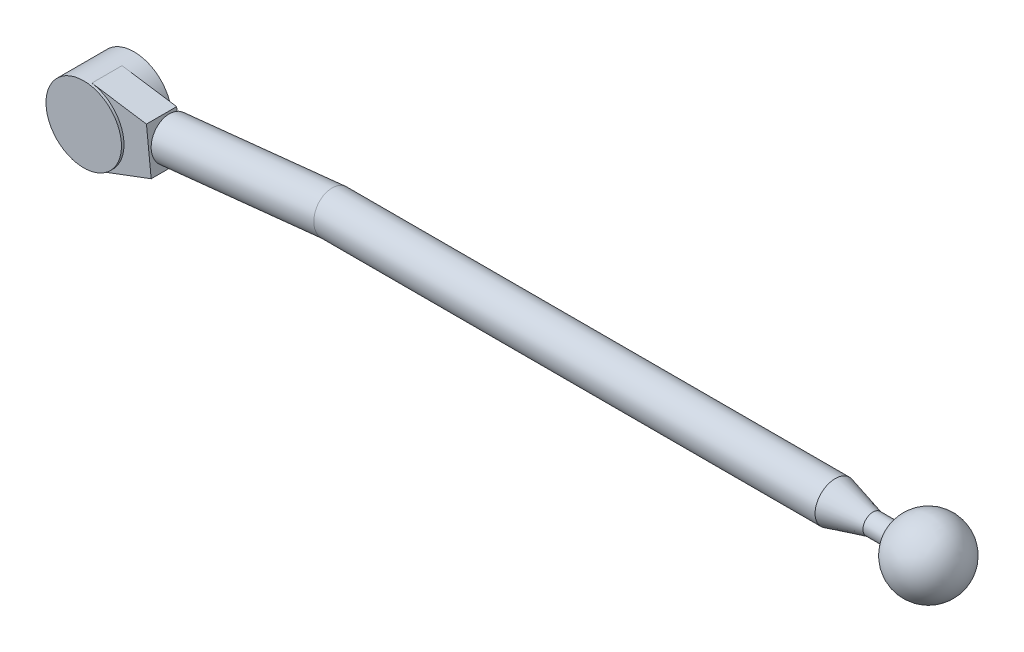
ISO-10303-21;
HEADER;
FILE_DESCRIPTION(('STEP AP214'),'2;1');
FILE_NAME('part.step','',(''),(''),'','','');
FILE_SCHEMA(('AUTOMOTIVE_DESIGN { 1 0 10303 214 1 1 1 1 }'));
ENDSEC;
DATA;
#1=APPLICATION_CONTEXT('core data for automotive mechanical design processes');
#2=APPLICATION_PROTOCOL_DEFINITION('international standard','automotive_design',2000,#1);
#3=PRODUCT_CONTEXT('',#1,'mechanical');
#4=PRODUCT('Part','Part','',(#3));
#5=PRODUCT_RELATED_PRODUCT_CATEGORY('part','',(#4));
#6=PRODUCT_DEFINITION_FORMATION('','',#4);
#7=PRODUCT_DEFINITION_CONTEXT('part definition',#1,'design');
#8=PRODUCT_DEFINITION('design','',#6,#7);
#9=PRODUCT_DEFINITION_SHAPE('','',#8);
#10=(LENGTH_UNIT() NAMED_UNIT(*) SI_UNIT(.MILLI.,.METRE.));
#11=(NAMED_UNIT(*) PLANE_ANGLE_UNIT() SI_UNIT($,.RADIAN.));
#12=(NAMED_UNIT(*) SI_UNIT($,.STERADIAN.) SOLID_ANGLE_UNIT());
#13=UNCERTAINTY_MEASURE_WITH_UNIT(LENGTH_MEASURE(1.E-05),#10,'distance_accuracy_value','');
#14=(GEOMETRIC_REPRESENTATION_CONTEXT(3) GLOBAL_UNCERTAINTY_ASSIGNED_CONTEXT((#13)) GLOBAL_UNIT_ASSIGNED_CONTEXT((#10,
#11,#12)) REPRESENTATION_CONTEXT('',''));
#15=CARTESIAN_POINT('',(0.,0.,0.));
#16=DIRECTION('',(0.,0.,1.));
#17=DIRECTION('',(1.,0.,0.));
#18=AXIS2_PLACEMENT_3D('',#15,#16,#17);
#19=CARTESIAN_POINT('',(-236.360559982317,88.4268991587526,1407.2355645497));
#20=DIRECTION('',(0.,1.,0.));
#21=DIRECTION('',(0.,0.,-1.));
#22=AXIS2_PLACEMENT_3D('',#19,#20,#21);
#23=SPHERICAL_SURFACE('',#22,14.);
#24=CARTESIAN_POINT('',(-236.360559982317,88.4268991587526,1407.2355645497));
#25=DIRECTION('',(-1.,0.,0.));
#26=DIRECTION('',(0.,1.,0.));
#27=AXIS2_PLACEMENT_3D('',#24,#25,#26);
#28=SPHERICAL_SURFACE('',#27,14.);
#29=CARTESIAN_POINT('',(-249.776967847315,88.4268991587526,1407.2355645497));
#30=DIRECTION('',(-0.999999999999999,0.,0.));
#31=DIRECTION('',(0.,1.,0.));
#32=AXIS2_PLACEMENT_3D('',#29,#30,#31);
#33=CIRCLE('',#32,4.);
#34=CARTESIAN_POINT('',(-249.776967847315,92.4268991587526,1407.2355645497));
#35=VERTEX_POINT('',#34);
#36=EDGE_CURVE('E182',#35,#35,#33,.F.);
#37=ORIENTED_EDGE('',*,*,#36,.T.);
#38=EDGE_LOOP('',(#37));
#39=FACE_BOUND('',#38,.T.);
#40=ADVANCED_FACE('F47',(#39),#28,.T.);
#41=CARTESIAN_POINT('',(-258.360559982317,88.4268991587526,1407.2355645497));
#42=DIRECTION('',(1.,0.,0.));
#43=DIRECTION('',(0.,1.,0.));
#44=AXIS2_PLACEMENT_3D('',#41,#42,#43);
#45=CYLINDRICAL_SURFACE('',#44,4.);
#46=CARTESIAN_POINT('',(-258.360559982317,88.4268991587526,1407.2355645497));
#47=DIRECTION('',(1.,0.,0.));
#48=DIRECTION('',(0.,-1.,0.));
#49=AXIS2_PLACEMENT_3D('',#46,#47,#48);
#50=CIRCLE('',#49,4.);
#51=CARTESIAN_POINT('',(-258.360559982317,84.4268991587526,1407.2355645497));
#52=VERTEX_POINT('',#51);
#53=EDGE_CURVE('E186',#52,#52,#50,.T.);
#54=ORIENTED_EDGE('',*,*,#53,.T.);
#55=EDGE_LOOP('',(#54));
#56=FACE_BOUND('',#55,.T.);
#57=ORIENTED_EDGE('',*,*,#36,.F.);
#58=EDGE_LOOP('',(#57));
#59=FACE_BOUND('',#58,.T.);
#60=ADVANCED_FACE('F171',(#56,#59),#45,.T.);
#61=CARTESIAN_POINT('',(-258.360559982317,88.4268991587526,1407.2355645497));
#62=DIRECTION('',(-1.,0.,0.));
#63=DIRECTION('',(0.,-1.,0.));
#64=AXIS2_PLACEMENT_3D('',#61,#62,#63);
#65=CONICAL_SURFACE('',#64,4.,0.261799387799149);
#66=CARTESIAN_POINT('',(-273.360559982317,88.4268991587526,1407.2355645497));
#67=DIRECTION('',(1.,0.,0.));
#68=DIRECTION('',(0.,-1.,0.));
#69=AXIS2_PLACEMENT_3D('',#66,#67,#68);
#70=CIRCLE('',#69,8.01923788646685);
#71=CARTESIAN_POINT('',(-273.360559982317,80.4076612722857,1407.2355645497));
#72=VERTEX_POINT('',#71);
#73=EDGE_CURVE('E153',#72,#72,#70,.T.);
#74=ORIENTED_EDGE('',*,*,#73,.T.);
#75=EDGE_LOOP('',(#74));
#76=FACE_BOUND('',#75,.T.);
#77=ORIENTED_EDGE('',*,*,#53,.F.);
#78=EDGE_LOOP('',(#77));
#79=FACE_BOUND('',#78,.T.);
#80=ADVANCED_FACE('F167',(#76,#79),#65,.T.);
#81=CARTESIAN_POINT('',(-473.360559982317,88.4268991587526,1407.2355645497));
#82=DIRECTION('',(1.,0.,0.));
#83=DIRECTION('',(0.,1.,0.));
#84=AXIS2_PLACEMENT_3D('',#81,#82,#83);
#85=CYLINDRICAL_SURFACE('',#84,8.01923788646685);
#86=CARTESIAN_POINT('',(-472.517704116846,88.4268991587526,1407.2355645497));
#87=DIRECTION('',(0.994521895368274,0.104528463267644,0.));
#88=DIRECTION('',(0.104528463267644,-0.994521895368274,0.));
#89=AXIS2_PLACEMENT_3D('',#86,#87,#88);
#90=ELLIPSE('',#89,8.06341009063184,8.01923788646685);
#91=CARTESIAN_POINT('',(-471.674848251376,80.4076612722857,1407.2355645497));
#92=VERTEX_POINT('',#91);
#93=EDGE_CURVE('E147',#92,#92,#90,.T.);
#94=ORIENTED_EDGE('',*,*,#93,.T.);
#95=EDGE_LOOP('',(#94));
#96=FACE_BOUND('',#95,.T.);
#97=ORIENTED_EDGE('',*,*,#73,.F.);
#98=EDGE_LOOP('',(#97));
#99=FACE_BOUND('',#98,.T.);
#100=ADVANCED_FACE('F162',(#96,#99),#85,.T.);
#101=CARTESIAN_POINT('',(-537.161627315784,81.6325490463557,1407.2355645497));
#102=DIRECTION('',(0.994521895368274,0.104528463267644,0.));
#103=DIRECTION('',(0.104528463267644,-0.994521895368274,0.));
#104=AXIS2_PLACEMENT_3D('',#101,#102,#103);
#105=ELLIPSE('',#104,8.06341009063184,8.01923788646685);
#106=DIRECTION('',(0.994521895368274,0.104528463267644,0.));
#107=VECTOR('',#106,1.);
#108=SURFACE_OF_LINEAR_EXTRUSION('',#105,#107);
#109=CARTESIAN_POINT('',(-536.379972719737,74.1956023422475,1404.2355645497));
#110=VERTEX_POINT('',#109);
#111=CARTESIAN_POINT('',(-537.943281911831,89.069495750464,1404.2355645497));
#112=VERTEX_POINT('',#111);
#113=EDGE_CURVE('E148',#110,#112,#105,.T.);
#114=ORIENTED_EDGE('',*,*,#113,.T.);
#115=EDGE_CURVE('E154',#112,#110,#105,.T.);
#116=ORIENTED_EDGE('',*,*,#115,.T.);
#117=EDGE_LOOP('',(#114,#116));
#118=FACE_BOUND('',#117,.T.);
#119=ORIENTED_EDGE('',*,*,#93,.F.);
#120=EDGE_LOOP('',(#119));
#121=FACE_BOUND('',#120,.T.);
#122=ADVANCED_FACE('F157',(#118,#121),#108,.T.);
#123=CARTESIAN_POINT('',(-537.161627315784,81.6325490463557,1407.2355645497));
#124=DIRECTION('',(-0.994521895368274,-0.104528463267644,0.));
#125=DIRECTION('',(0.104528463267644,-0.994521895368274,0.));
#126=AXIS2_PLACEMENT_3D('',#123,#124,#125);
#127=PLANE('',#126);
#128=DIRECTION('',(-0.104528463267639,0.994521895368275,0.));
#129=VECTOR('',#128,1.);
#130=CARTESIAN_POINT('',(-538.102383485193,90.5832461046702,1404.2355645497));
#131=LINE('',#130,#129);
#132=EDGE_CURVE('E185',#110,#112,#131,.T.);
#133=ORIENTED_EDGE('',*,*,#132,.T.);
#134=ORIENTED_EDGE('',*,*,#113,.F.);
#135=EDGE_LOOP('',(#133,#134));
#136=FACE_BOUND('',#135,.T.);
#137=ADVANCED_FACE('F161',(#136),#127,.T.);
#138=CARTESIAN_POINT('',(-538.102383485193,90.5832461046702,1404.2355645497));
#139=DIRECTION('',(-0.994521895368275,-0.104528463267639,0.));
#140=DIRECTION('',(0.104528463267639,-0.994521895368275,0.));
#141=AXIS2_PLACEMENT_3D('',#138,#139,#140);
#142=PLANE('',#141);
#143=CARTESIAN_POINT('',(-538.102383485193,90.5832461046702,1404.2355645497));
#144=VERTEX_POINT('',#143);
#145=EDGE_CURVE('E70',#112,#144,#131,.T.);
#146=ORIENTED_EDGE('',*,*,#145,.T.);
#147=DIRECTION('',(0.,0.,1.));
#148=VECTOR('',#147,1.);
#149=CARTESIAN_POINT('',(-538.102383485193,90.5832461046702,1404.2355645497));
#150=LINE('',#149,#148);
#151=CARTESIAN_POINT('',(-538.102383485193,90.5832461046702,1416.2355645497));
#152=VERTEX_POINT('',#151);
#153=EDGE_CURVE('E141',#144,#152,#150,.T.);
#154=ORIENTED_EDGE('',*,*,#153,.T.);
#155=DIRECTION('',(-0.104528463267639,0.994521895368275,0.));
#156=VECTOR('',#155,1.);
#157=CARTESIAN_POINT('',(-538.102383485193,90.5832461046702,1416.2355645497));
#158=LINE('',#157,#156);
#159=CARTESIAN_POINT('',(-536.220871146375,72.6818519880413,1416.2355645497));
#160=VERTEX_POINT('',#159);
#161=EDGE_CURVE('E124',#160,#152,#158,.T.);
#162=ORIENTED_EDGE('',*,*,#161,.F.);
#163=DIRECTION('',(0.,0.,1.));
#164=VECTOR('',#163,1.);
#165=CARTESIAN_POINT('',(-536.220871146375,72.6818519880413,1404.2355645497));
#166=LINE('',#165,#164);
#167=CARTESIAN_POINT('',(-536.220871146375,72.6818519880413,1404.2355645497));
#168=VERTEX_POINT('',#167);
#169=EDGE_CURVE('E121',#168,#160,#166,.T.);
#170=ORIENTED_EDGE('',*,*,#169,.F.);
#171=EDGE_CURVE('E63',#168,#110,#131,.T.);
#172=ORIENTED_EDGE('',*,*,#171,.T.);
#173=ORIENTED_EDGE('',*,*,#115,.F.);
#174=EDGE_LOOP('',(#146,#154,#162,#170,#172,#173));
#175=FACE_BOUND('',#174,.T.);
#176=ADVANCED_FACE('F227',(#175),#142,.F.);
#177=CARTESIAN_POINT('',(-536.220871146375,72.6818519880413,1404.2355645497));
#178=DIRECTION('',(-0.351367061986771,0.936237783765847,0.));
#179=DIRECTION('',(-0.936237783765847,-0.351367061986771,0.));
#180=AXIS2_PLACEMENT_3D('',#177,#178,#179);
#181=PLANE('',#180);
#182=DIRECTION('',(0.936237783765847,0.351367061986771,0.));
#183=VECTOR('',#182,1.);
#184=CARTESIAN_POINT('',(-536.220871146375,72.6818519880413,1416.2355645497));
#185=LINE('',#184,#183);
#186=CARTESIAN_POINT('',(-556.754168770189,64.975770708177,1416.2355645497));
#187=VERTEX_POINT('',#186);
#188=EDGE_CURVE('E101',#187,#160,#185,.T.);
#189=ORIENTED_EDGE('',*,*,#188,.F.);
#190=DIRECTION('',(0.,0.,1.));
#191=VECTOR('',#190,1.);
#192=CARTESIAN_POINT('',(-556.754168770189,64.975770708177,1404.2355645497));
#193=LINE('',#192,#191);
#194=CARTESIAN_POINT('',(-556.754168770189,64.975770708177,1404.2355645497));
#195=VERTEX_POINT('',#194);
#196=EDGE_CURVE('E111',#195,#187,#193,.T.);
#197=ORIENTED_EDGE('',*,*,#196,.F.);
#198=DIRECTION('',(0.936237783765847,0.351367061986771,0.));
#199=VECTOR('',#198,1.);
#200=CARTESIAN_POINT('',(-536.220871146375,72.6818519880413,1404.2355645497));
#201=LINE('',#200,#199);
#202=EDGE_CURVE('E108',#195,#168,#201,.T.);
#203=ORIENTED_EDGE('',*,*,#202,.T.);
#204=ORIENTED_EDGE('',*,*,#169,.T.);
#205=EDGE_LOOP('',(#189,#197,#203,#204));
#206=FACE_BOUND('',#205,.T.);
#207=ADVANCED_FACE('F120',(#206),#181,.F.);
#208=CARTESIAN_POINT('',(-538.102383485193,90.5832461046702,1404.2355645497));
#209=DIRECTION('',(-0.149034068029049,-0.988832061862232,0.));
#210=DIRECTION('',(0.988832061862232,-0.149034068029049,0.));
#211=AXIS2_PLACEMENT_3D('',#208,#209,#210);
#212=PLANE('',#211);
#213=DIRECTION('',(-0.988832061862232,0.149034068029049,0.));
#214=VECTOR('',#213,1.);
#215=CARTESIAN_POINT('',(-538.102383485193,90.5832461046702,1416.2355645497));
#216=LINE('',#215,#214);
#217=CARTESIAN_POINT('',(-559.789163679555,93.8518183925981,1416.2355645497));
#218=VERTEX_POINT('',#217);
#219=EDGE_CURVE('E103',#152,#218,#216,.T.);
#220=ORIENTED_EDGE('',*,*,#219,.F.);
#221=ORIENTED_EDGE('',*,*,#153,.F.);
#222=DIRECTION('',(-0.988832061862232,0.149034068029049,0.));
#223=VECTOR('',#222,1.);
#224=CARTESIAN_POINT('',(-538.102383485193,90.5832461046702,1404.2355645497));
#225=LINE('',#224,#223);
#226=CARTESIAN_POINT('',(-559.789163679555,93.8518183925981,1404.2355645497));
#227=VERTEX_POINT('',#226);
#228=EDGE_CURVE('E347',#144,#227,#225,.T.);
#229=ORIENTED_EDGE('',*,*,#228,.T.);
#230=DIRECTION('',(0.,0.,1.));
#231=VECTOR('',#230,1.);
#232=CARTESIAN_POINT('',(-559.789163679555,93.8518183925981,1404.2355645497));
#233=LINE('',#232,#231);
#234=EDGE_CURVE('E118',#227,#218,#233,.T.);
#235=ORIENTED_EDGE('',*,*,#234,.T.);
#236=EDGE_LOOP('',(#220,#221,#229,#235));
#237=FACE_BOUND('',#236,.T.);
#238=ADVANCED_FACE('F221',(#237),#212,.F.);
#239=CARTESIAN_POINT('',(-562.024674699991,79.0193374646647,1404.2355645497));
#240=DIRECTION('',(0.,0.,-1.));
#241=DIRECTION('',(0.,1.,0.));
#242=AXIS2_PLACEMENT_3D('',#239,#240,#241);
#243=PLANE('',#242);
#244=ORIENTED_EDGE('',*,*,#202,.F.);
#245=CARTESIAN_POINT('',(-562.024674699991,79.0193374646647,1404.2355645497));
#246=DIRECTION('',(0.,0.,-1.));
#247=DIRECTION('',(0.,1.,0.));
#248=AXIS2_PLACEMENT_3D('',#245,#246,#247);
#249=CIRCLE('',#248,15.);
#250=EDGE_CURVE('E114',#227,#195,#249,.T.);
#251=ORIENTED_EDGE('',*,*,#250,.F.);
#252=ORIENTED_EDGE('',*,*,#228,.F.);
#253=ORIENTED_EDGE('',*,*,#145,.F.);
#254=ORIENTED_EDGE('',*,*,#132,.F.);
#255=ORIENTED_EDGE('',*,*,#171,.F.);
#256=EDGE_LOOP('',(#244,#251,#252,#253,#254,#255));
#257=FACE_BOUND('',#256,.T.);
#258=ADVANCED_FACE('F218',(#257),#243,.T.);
#259=CARTESIAN_POINT('',(-562.024674699991,79.0193374646647,1416.2355645497));
#260=DIRECTION('',(0.,0.,-1.));
#261=DIRECTION('',(0.,1.,0.));
#262=AXIS2_PLACEMENT_3D('',#259,#260,#261);
#263=PLANE('',#262);
#264=ORIENTED_EDGE('',*,*,#188,.T.);
#265=ORIENTED_EDGE('',*,*,#161,.T.);
#266=ORIENTED_EDGE('',*,*,#219,.T.);
#267=CARTESIAN_POINT('',(-562.024674699991,79.0193374646647,1416.2355645497));
#268=DIRECTION('',(0.,0.,-1.));
#269=DIRECTION('',(0.,1.,0.));
#270=AXIS2_PLACEMENT_3D('',#267,#268,#269);
#271=CIRCLE('',#270,15.);
#272=EDGE_CURVE('E96',#218,#187,#271,.T.);
#273=ORIENTED_EDGE('',*,*,#272,.T.);
#274=EDGE_LOOP('',(#264,#265,#266,#273));
#275=FACE_BOUND('',#274,.T.);
#276=ADVANCED_FACE('F98',(#275),#263,.F.);
#277=CARTESIAN_POINT('',(-562.024674699991,79.0193374646647,1397.2355645497));
#278=DIRECTION('',(0.,0.,1.));
#279=DIRECTION('',(0.,-1.,0.));
#280=AXIS2_PLACEMENT_3D('',#277,#278,#279);
#281=CYLINDRICAL_SURFACE('',#280,15.);
#282=ORIENTED_EDGE('',*,*,#250,.T.);
#283=ORIENTED_EDGE('',*,*,#196,.T.);
#284=ORIENTED_EDGE('',*,*,#272,.F.);
#285=ORIENTED_EDGE('',*,*,#234,.F.);
#286=EDGE_LOOP('',(#282,#283,#284,#285));
#287=FACE_BOUND('',#286,.T.);
#288=CARTESIAN_POINT('',(-562.024674699991,79.0193374646647,1397.2355645497));
#289=DIRECTION('',(0.,0.,1.));
#290=DIRECTION('',(0.,1.,0.));
#291=AXIS2_PLACEMENT_3D('',#288,#289,#290);
#292=CIRCLE('',#291,15.);
#293=CARTESIAN_POINT('',(-562.024674699991,94.0193374646647,1397.2355645497));
#294=VERTEX_POINT('',#293);
#295=EDGE_CURVE('E125',#294,#294,#292,.T.);
#296=ORIENTED_EDGE('',*,*,#295,.T.);
#297=EDGE_LOOP('',(#296));
#298=FACE_BOUND('',#297,.T.);
#299=CARTESIAN_POINT('',(-562.024674699991,79.0193374646647,1417.2355645497));
#300=DIRECTION('',(0.,0.,1.));
#301=DIRECTION('',(0.,1.,0.));
#302=AXIS2_PLACEMENT_3D('',#299,#300,#301);
#303=CIRCLE('',#302,15.);
#304=CARTESIAN_POINT('',(-562.024674699991,94.0193374646647,1417.2355645497));
#305=VERTEX_POINT('',#304);
#306=EDGE_CURVE('E133',#305,#305,#303,.T.);
#307=ORIENTED_EDGE('',*,*,#306,.F.);
#308=EDGE_LOOP('',(#307));
#309=FACE_BOUND('',#308,.T.);
#310=ADVANCED_FACE('F112',(#287,#298,#309),#281,.T.);
#311=CARTESIAN_POINT('',(-562.024674699991,79.0193374646647,1397.2355645497));
#312=DIRECTION('',(0.,0.,-1.));
#313=DIRECTION('',(0.,1.,0.));
#314=AXIS2_PLACEMENT_3D('',#311,#312,#313);
#315=PLANE('',#314);
#316=CARTESIAN_POINT('',(-562.024674699991,79.0193374646647,1397.2355645497));
#317=DIRECTION('',(0.,0.,1.));
#318=DIRECTION('',(0.,1.,0.));
#319=AXIS2_PLACEMENT_3D('',#316,#317,#318);
#320=CIRCLE('',#319,13.);
#321=CARTESIAN_POINT('',(-562.024674699991,92.0193374646647,1397.2355645497));
#322=VERTEX_POINT('',#321);
#323=EDGE_CURVE('E11',#322,#322,#320,.F.);
#324=ORIENTED_EDGE('',*,*,#323,.F.);
#325=EDGE_LOOP('',(#324));
#326=FACE_BOUND('',#325,.T.);
#327=ORIENTED_EDGE('',*,*,#295,.F.);
#328=EDGE_LOOP('',(#327));
#329=FACE_BOUND('',#328,.T.);
#330=ADVANCED_FACE('F209',(#326,#329),#315,.T.);
#331=CARTESIAN_POINT('',(-562.024674699991,79.0193374646647,1417.2355645497));
#332=DIRECTION('',(0.,0.,-1.));
#333=DIRECTION('',(0.,1.,0.));
#334=AXIS2_PLACEMENT_3D('',#331,#332,#333);
#335=PLANE('',#334);
#336=ORIENTED_EDGE('',*,*,#306,.T.);
#337=EDGE_LOOP('',(#336));
#338=FACE_BOUND('',#337,.T.);
#339=ADVANCED_FACE('F201',(#338),#335,.F.);
#340=CARTESIAN_POINT('',(-562.024674699991,79.0193374646647,1405.2355645497));
#341=DIRECTION('',(-1.,0.,0.));
#342=DIRECTION('',(0.,-1.,0.));
#343=AXIS2_PLACEMENT_3D('',#340,#341,#342);
#344=SPHERICAL_SURFACE('',#343,10.);
#345=CARTESIAN_POINT('',(-562.024674699991,79.0193374646647,1405.2355645497));
#346=DIRECTION('',(0.,0.,-1.));
#347=DIRECTION('',(0.,-1.,0.));
#348=AXIS2_PLACEMENT_3D('',#345,#346,#347);
#349=SPHERICAL_SURFACE('',#348,10.);
#350=CARTESIAN_POINT('',(-562.024674699991,79.0193374646647,1399.32865793649));
#351=DIRECTION('',(0.,0.,-1.));
#352=DIRECTION('',(0.,-1.,0.));
#353=AXIS2_PLACEMENT_3D('',#350,#351,#352);
#354=CIRCLE('',#353,8.06898099284036);
#355=CARTESIAN_POINT('',(-562.024674699991,70.9503564718244,1399.32865793649));
#356=VERTEX_POINT('',#355);
#357=EDGE_CURVE('E56',#356,#356,#354,.F.);
#358=ORIENTED_EDGE('',*,*,#357,.F.);
#359=EDGE_LOOP('',(#358));
#360=FACE_BOUND('',#359,.T.);
#361=ADVANCED_FACE('F199',(#360),#349,.F.);
#362=CARTESIAN_POINT('',(-562.024674699991,79.0193374646647,1399.32865793649));
#363=DIRECTION('',(0.,0.,-1.));
#364=DIRECTION('',(0.,1.,0.));
#365=AXIS2_PLACEMENT_3D('',#362,#363,#364);
#366=CONICAL_SURFACE('',#365,8.06898099284036,1.16937059883619);
#367=ORIENTED_EDGE('',*,*,#323,.T.);
#368=EDGE_LOOP('',(#367));
#369=FACE_BOUND('',#368,.T.);
#370=ORIENTED_EDGE('',*,*,#357,.T.);
#371=EDGE_LOOP('',(#370));
#372=FACE_BOUND('',#371,.T.);
#373=ADVANCED_FACE('F49',(#369,#372),#366,.F.);
#374=CLOSED_SHELL('',(#40,#60,#80,#100,#122,#137,#176,#207,#238,#258,#276,#310,#330,#339,#361,#373));
#375=MANIFOLD_SOLID_BREP('B2',#374);
#376=ADVANCED_BREP_SHAPE_REPRESENTATION('',(#18,#375),#14);
#377=SHAPE_DEFINITION_REPRESENTATION(#9,#376);
ENDSEC;
END-ISO-10303-21;
